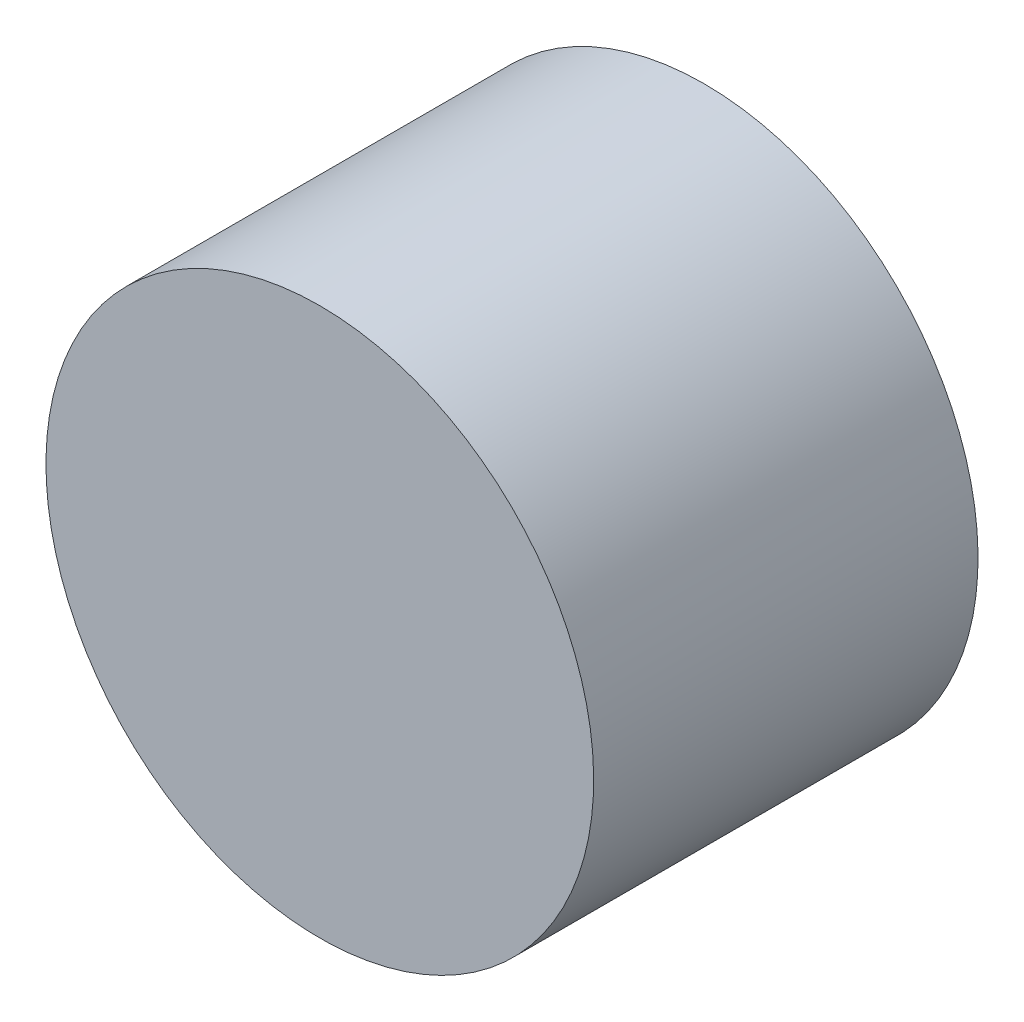
ISO-10303-21;
HEADER;
FILE_DESCRIPTION(('STEP AP214'),'2;1');
FILE_NAME('part.step','',(''),(''),'','','');
FILE_SCHEMA(('AUTOMOTIVE_DESIGN { 1 0 10303 214 1 1 1 1 }'));
ENDSEC;
DATA;
#1=APPLICATION_CONTEXT('core data for automotive mechanical design processes');
#2=APPLICATION_PROTOCOL_DEFINITION('international standard','automotive_design',2000,#1);
#3=PRODUCT_CONTEXT('',#1,'mechanical');
#4=PRODUCT('Part','Part','',(#3));
#5=PRODUCT_RELATED_PRODUCT_CATEGORY('part','',(#4));
#6=PRODUCT_DEFINITION_FORMATION('','',#4);
#7=PRODUCT_DEFINITION_CONTEXT('part definition',#1,'design');
#8=PRODUCT_DEFINITION('design','',#6,#7);
#9=PRODUCT_DEFINITION_SHAPE('','',#8);
#10=(LENGTH_UNIT() NAMED_UNIT(*) SI_UNIT(.MILLI.,.METRE.));
#11=(NAMED_UNIT(*) PLANE_ANGLE_UNIT() SI_UNIT($,.RADIAN.));
#12=(NAMED_UNIT(*) SI_UNIT($,.STERADIAN.) SOLID_ANGLE_UNIT());
#13=UNCERTAINTY_MEASURE_WITH_UNIT(LENGTH_MEASURE(1.E-05),#10,'distance_accuracy_value','');
#14=(GEOMETRIC_REPRESENTATION_CONTEXT(3) GLOBAL_UNCERTAINTY_ASSIGNED_CONTEXT((#13)) GLOBAL_UNIT_ASSIGNED_CONTEXT((#10,
#11,#12)) REPRESENTATION_CONTEXT('',''));
#15=CARTESIAN_POINT('',(0.,0.,0.));
#16=DIRECTION('',(0.,0.,1.));
#17=DIRECTION('',(1.,0.,0.));
#18=AXIS2_PLACEMENT_3D('',#15,#16,#17);
#19=CARTESIAN_POINT('',(0.,0.,40.));
#20=DIRECTION('',(0.,0.,1.));
#21=DIRECTION('',(0.,-1.,0.));
#22=AXIS2_PLACEMENT_3D('',#19,#20,#21);
#23=PLANE('',#22);
#24=CARTESIAN_POINT('',(0.,0.,40.));
#25=DIRECTION('',(0.,0.,-1.));
#26=DIRECTION('',(0.,1.,0.));
#27=AXIS2_PLACEMENT_3D('',#24,#25,#26);
#28=CIRCLE('',#27,28.5);
#29=CARTESIAN_POINT('',(0.,28.5,40.));
#30=VERTEX_POINT('',#29);
#31=EDGE_CURVE('E12',#30,#30,#28,.T.);
#32=ORIENTED_EDGE('',*,*,#31,.F.);
#33=EDGE_LOOP('',(#32));
#34=FACE_BOUND('',#33,.T.);
#35=ADVANCED_FACE('F40',(#34),#23,.T.);
#36=CARTESIAN_POINT('',(0.,0.,28.));
#37=DIRECTION('',(0.,0.,-1.));
#38=DIRECTION('',(0.,1.,0.));
#39=AXIS2_PLACEMENT_3D('',#36,#37,#38);
#40=CYLINDRICAL_SURFACE('',#39,28.5);
#41=ORIENTED_EDGE('',*,*,#31,.T.);
#42=EDGE_LOOP('',(#41));
#43=FACE_BOUND('',#42,.T.);
#44=CARTESIAN_POINT('',(0.,0.,0.));
#45=DIRECTION('',(0.,0.,-1.));
#46=DIRECTION('',(0.,1.,0.));
#47=AXIS2_PLACEMENT_3D('',#44,#45,#46);
#48=CIRCLE('',#47,28.5);
#49=CARTESIAN_POINT('',(0.,28.5,0.));
#50=VERTEX_POINT('',#49);
#51=EDGE_CURVE('E46',#50,#50,#48,.T.);
#52=ORIENTED_EDGE('',*,*,#51,.F.);
#53=EDGE_LOOP('',(#52));
#54=FACE_BOUND('',#53,.T.);
#55=ADVANCED_FACE('F72',(#43,#54),#40,.T.);
#56=CARTESIAN_POINT('',(0.,28.5,0.));
#57=DIRECTION('',(0.,0.,-1.));
#58=DIRECTION('',(0.,1.,0.));
#59=AXIS2_PLACEMENT_3D('',#56,#57,#58);
#60=PLANE('',#59);
#61=ORIENTED_EDGE('',*,*,#51,.T.);
#62=EDGE_LOOP('',(#61));
#63=FACE_BOUND('',#62,.T.);
#64=CARTESIAN_POINT('',(0.,0.,0.));
#65=DIRECTION('',(0.,0.,-1.));
#66=DIRECTION('',(0.,1.,0.));
#67=AXIS2_PLACEMENT_3D('',#64,#65,#66);
#68=CIRCLE('',#67,13.5);
#69=CARTESIAN_POINT('',(0.,13.5,0.));
#70=VERTEX_POINT('',#69);
#71=EDGE_CURVE('E50',#70,#70,#68,.T.);
#72=ORIENTED_EDGE('',*,*,#71,.F.);
#73=EDGE_LOOP('',(#72));
#74=FACE_BOUND('',#73,.T.);
#75=ADVANCED_FACE('F64',(#63,#74),#60,.T.);
#76=CARTESIAN_POINT('',(0.,0.,28.));
#77=DIRECTION('',(0.,0.,-1.));
#78=DIRECTION('',(0.,1.,0.));
#79=AXIS2_PLACEMENT_3D('',#76,#77,#78);
#80=CYLINDRICAL_SURFACE('',#79,13.5);
#81=ORIENTED_EDGE('',*,*,#71,.T.);
#82=EDGE_LOOP('',(#81));
#83=FACE_BOUND('',#82,.T.);
#84=CARTESIAN_POINT('',(0.,0.,28.));
#85=DIRECTION('',(0.,0.,-1.));
#86=DIRECTION('',(0.,1.,0.));
#87=AXIS2_PLACEMENT_3D('',#84,#85,#86);
#88=CIRCLE('',#87,13.5);
#89=CARTESIAN_POINT('',(0.,13.5,28.));
#90=VERTEX_POINT('',#89);
#91=EDGE_CURVE('E54',#90,#90,#88,.T.);
#92=ORIENTED_EDGE('',*,*,#91,.F.);
#93=EDGE_LOOP('',(#92));
#94=FACE_BOUND('',#93,.T.);
#95=ADVANCED_FACE('F62',(#83,#94),#80,.F.);
#96=CARTESIAN_POINT('',(0.,13.5,28.));
#97=DIRECTION('',(0.,0.,-1.));
#98=DIRECTION('',(0.,1.,0.));
#99=AXIS2_PLACEMENT_3D('',#96,#97,#98);
#100=PLANE('',#99);
#101=ORIENTED_EDGE('',*,*,#91,.T.);
#102=EDGE_LOOP('',(#101));
#103=FACE_BOUND('',#102,.T.);
#104=ADVANCED_FACE('F60',(#103),#100,.T.);
#105=CLOSED_SHELL('',(#35,#55,#75,#95,#104));
#106=MANIFOLD_SOLID_BREP('B2',#105);
#107=ADVANCED_BREP_SHAPE_REPRESENTATION('',(#18,#106),#14);
#108=SHAPE_DEFINITION_REPRESENTATION(#9,#107);
ENDSEC;
END-ISO-10303-21;
